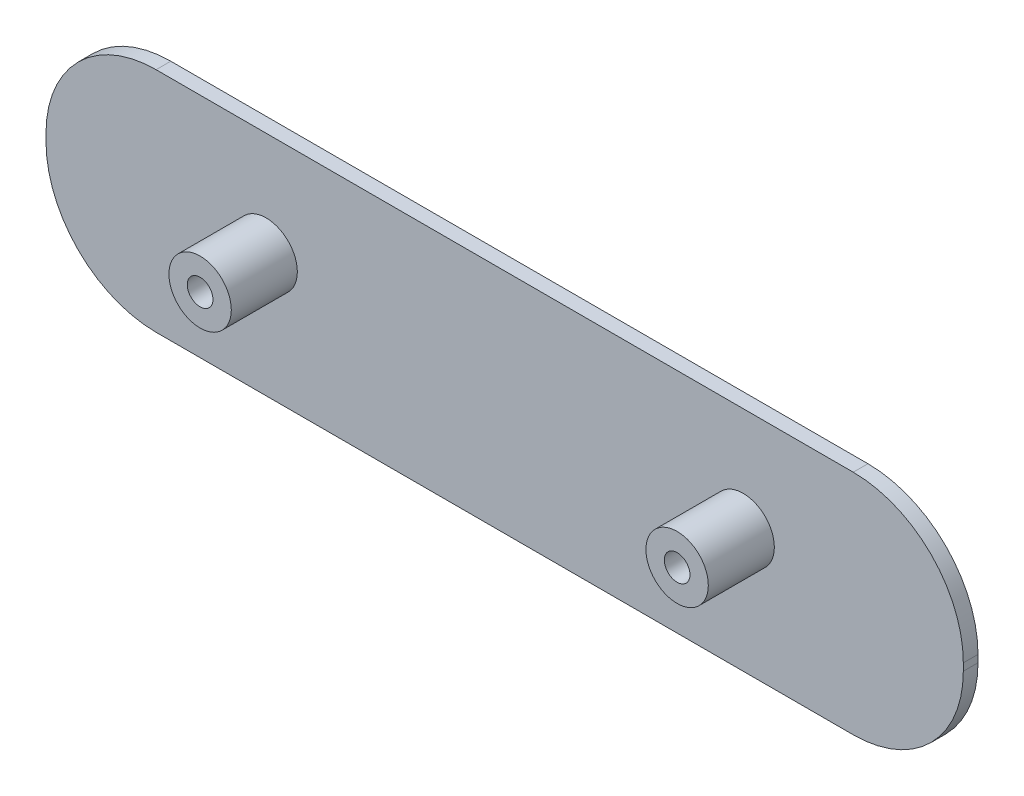
ISO-10303-21;
HEADER;
FILE_DESCRIPTION(('STEP AP214'),'2;1');
FILE_NAME('part.step','',(''),(''),'','','');
FILE_SCHEMA(('AUTOMOTIVE_DESIGN { 1 0 10303 214 1 1 1 1 }'));
ENDSEC;
DATA;
#1=APPLICATION_CONTEXT('core data for automotive mechanical design processes');
#2=APPLICATION_PROTOCOL_DEFINITION('international standard','automotive_design',2000,#1);
#3=PRODUCT_CONTEXT('',#1,'mechanical');
#4=PRODUCT('Part','Part','',(#3));
#5=PRODUCT_RELATED_PRODUCT_CATEGORY('part','',(#4));
#6=PRODUCT_DEFINITION_FORMATION('','',#4);
#7=PRODUCT_DEFINITION_CONTEXT('part definition',#1,'design');
#8=PRODUCT_DEFINITION('design','',#6,#7);
#9=PRODUCT_DEFINITION_SHAPE('','',#8);
#10=(LENGTH_UNIT() NAMED_UNIT(*) SI_UNIT(.MILLI.,.METRE.));
#11=(NAMED_UNIT(*) PLANE_ANGLE_UNIT() SI_UNIT($,.RADIAN.));
#12=(NAMED_UNIT(*) SI_UNIT($,.STERADIAN.) SOLID_ANGLE_UNIT());
#13=UNCERTAINTY_MEASURE_WITH_UNIT(LENGTH_MEASURE(1.E-05),#10,'distance_accuracy_value','');
#14=(GEOMETRIC_REPRESENTATION_CONTEXT(3) GLOBAL_UNCERTAINTY_ASSIGNED_CONTEXT((#13)) GLOBAL_UNIT_ASSIGNED_CONTEXT((#10,
#11,#12)) REPRESENTATION_CONTEXT('',''));
#15=CARTESIAN_POINT('',(0.,0.,0.));
#16=DIRECTION('',(0.,0.,1.));
#17=DIRECTION('',(1.,0.,0.));
#18=AXIS2_PLACEMENT_3D('',#15,#16,#17);
#19=CARTESIAN_POINT('',(0.,0.,2.));
#20=DIRECTION('',(-1.,0.,0.));
#21=DIRECTION('',(0.,-1.,0.));
#22=AXIS2_PLACEMENT_3D('',#19,#20,#21);
#23=PLANE('',#22);
#24=DIRECTION('',(0.,1.,0.));
#25=VECTOR('',#24,1.);
#26=CARTESIAN_POINT('',(0.,0.,0.));
#27=LINE('',#26,#25);
#28=CARTESIAN_POINT('',(0.,15.,0.));
#29=VERTEX_POINT('',#28);
#30=CARTESIAN_POINT('',(0.,15.99,0.));
#31=VERTEX_POINT('',#30);
#32=EDGE_CURVE('E133',#29,#31,#27,.T.);
#33=ORIENTED_EDGE('',*,*,#32,.T.);
#34=DIRECTION('',(0.,0.,-1.));
#35=VECTOR('',#34,1.);
#36=CARTESIAN_POINT('',(0.,15.99,2.));
#37=LINE('',#36,#35);
#38=CARTESIAN_POINT('',(0.,15.99,2.));
#39=VERTEX_POINT('',#38);
#40=EDGE_CURVE('E111',#31,#39,#37,.F.);
#41=ORIENTED_EDGE('',*,*,#40,.T.);
#42=DIRECTION('',(0.,1.,0.));
#43=VECTOR('',#42,1.);
#44=CARTESIAN_POINT('',(0.,0.,2.));
#45=LINE('',#44,#43);
#46=CARTESIAN_POINT('',(0.,15.,2.));
#47=VERTEX_POINT('',#46);
#48=EDGE_CURVE('E143',#47,#39,#45,.T.);
#49=ORIENTED_EDGE('',*,*,#48,.F.);
#50=DIRECTION('',(0.,0.,-1.));
#51=VECTOR('',#50,1.);
#52=CARTESIAN_POINT('',(0.,15.,2.));
#53=LINE('',#52,#51);
#54=EDGE_CURVE('E116',#47,#29,#53,.T.);
#55=ORIENTED_EDGE('',*,*,#54,.T.);
#56=EDGE_LOOP('',(#33,#41,#49,#55));
#57=FACE_BOUND('',#56,.T.);
#58=ADVANCED_FACE('F39',(#57),#23,.F.);
#59=CARTESIAN_POINT('',(0.,30.99,2.));
#60=DIRECTION('',(0.,-1.,0.));
#61=DIRECTION('',(1.,0.,0.));
#62=AXIS2_PLACEMENT_3D('',#59,#60,#61);
#63=PLANE('',#62);
#64=DIRECTION('',(-1.,0.,0.));
#65=VECTOR('',#64,1.);
#66=CARTESIAN_POINT('',(0.,30.99,2.));
#67=LINE('',#66,#65);
#68=CARTESIAN_POINT('',(-15.,30.99,2.));
#69=VERTEX_POINT('',#68);
#70=CARTESIAN_POINT('',(-110.,30.99,2.));
#71=VERTEX_POINT('',#70);
#72=EDGE_CURVE('E126',#69,#71,#67,.T.);
#73=ORIENTED_EDGE('',*,*,#72,.F.);
#74=DIRECTION('',(0.,0.,-1.));
#75=VECTOR('',#74,1.);
#76=CARTESIAN_POINT('',(-15.,30.99,2.));
#77=LINE('',#76,#75);
#78=CARTESIAN_POINT('',(-15.,30.99,0.));
#79=VERTEX_POINT('',#78);
#80=EDGE_CURVE('E110',#69,#79,#77,.T.);
#81=ORIENTED_EDGE('',*,*,#80,.T.);
#82=DIRECTION('',(-1.,0.,0.));
#83=VECTOR('',#82,1.);
#84=CARTESIAN_POINT('',(0.,30.99,0.));
#85=LINE('',#84,#83);
#86=CARTESIAN_POINT('',(-110.,30.99,0.));
#87=VERTEX_POINT('',#86);
#88=EDGE_CURVE('E123',#79,#87,#85,.T.);
#89=ORIENTED_EDGE('',*,*,#88,.T.);
#90=DIRECTION('',(0.,0.,-1.));
#91=VECTOR('',#90,1.);
#92=CARTESIAN_POINT('',(-110.,30.99,2.));
#93=LINE('',#92,#91);
#94=EDGE_CURVE('E128',#87,#71,#93,.F.);
#95=ORIENTED_EDGE('',*,*,#94,.T.);
#96=EDGE_LOOP('',(#73,#81,#89,#95));
#97=FACE_BOUND('',#96,.T.);
#98=ADVANCED_FACE('F122',(#97),#63,.F.);
#99=CARTESIAN_POINT('',(-125.,0.,2.));
#100=DIRECTION('',(1.,0.,0.));
#101=DIRECTION('',(0.,0.,-1.));
#102=AXIS2_PLACEMENT_3D('',#99,#100,#101);
#103=PLANE('',#102);
#104=DIRECTION('',(0.,-1.,0.));
#105=VECTOR('',#104,1.);
#106=CARTESIAN_POINT('',(-125.,0.,0.));
#107=LINE('',#106,#105);
#108=CARTESIAN_POINT('',(-125.,15.99,0.));
#109=VERTEX_POINT('',#108);
#110=CARTESIAN_POINT('',(-125.,15.,0.));
#111=VERTEX_POINT('',#110);
#112=EDGE_CURVE('E132',#109,#111,#107,.T.);
#113=ORIENTED_EDGE('',*,*,#112,.T.);
#114=DIRECTION('',(0.,0.,-1.));
#115=VECTOR('',#114,1.);
#116=CARTESIAN_POINT('',(-125.,15.,2.));
#117=LINE('',#116,#115);
#118=CARTESIAN_POINT('',(-125.,15.,2.));
#119=VERTEX_POINT('',#118);
#120=EDGE_CURVE('E167',#111,#119,#117,.F.);
#121=ORIENTED_EDGE('',*,*,#120,.T.);
#122=DIRECTION('',(0.,-1.,0.));
#123=VECTOR('',#122,1.);
#124=CARTESIAN_POINT('',(-125.,0.,2.));
#125=LINE('',#124,#123);
#126=CARTESIAN_POINT('',(-125.,15.99,2.));
#127=VERTEX_POINT('',#126);
#128=EDGE_CURVE('E230',#127,#119,#125,.T.);
#129=ORIENTED_EDGE('',*,*,#128,.F.);
#130=DIRECTION('',(0.,0.,-1.));
#131=VECTOR('',#130,1.);
#132=CARTESIAN_POINT('',(-125.,15.99,2.));
#133=LINE('',#132,#131);
#134=EDGE_CURVE('E164',#127,#109,#133,.T.);
#135=ORIENTED_EDGE('',*,*,#134,.T.);
#136=EDGE_LOOP('',(#113,#121,#129,#135));
#137=FACE_BOUND('',#136,.T.);
#138=ADVANCED_FACE('F205',(#137),#103,.F.);
#139=CARTESIAN_POINT('',(0.,0.,2.));
#140=DIRECTION('',(0.,1.,0.));
#141=DIRECTION('',(-1.,0.,0.));
#142=AXIS2_PLACEMENT_3D('',#139,#140,#141);
#143=PLANE('',#142);
#144=DIRECTION('',(1.,0.,0.));
#145=VECTOR('',#144,1.);
#146=CARTESIAN_POINT('',(0.,0.,0.));
#147=LINE('',#146,#145);
#148=CARTESIAN_POINT('',(-110.,0.,0.));
#149=VERTEX_POINT('',#148);
#150=CARTESIAN_POINT('',(-15.,0.,0.));
#151=VERTEX_POINT('',#150);
#152=EDGE_CURVE('E136',#149,#151,#147,.T.);
#153=ORIENTED_EDGE('',*,*,#152,.T.);
#154=DIRECTION('',(0.,0.,-1.));
#155=VECTOR('',#154,1.);
#156=CARTESIAN_POINT('',(-15.,0.,2.));
#157=LINE('',#156,#155);
#158=CARTESIAN_POINT('',(-15.,0.,2.));
#159=VERTEX_POINT('',#158);
#160=EDGE_CURVE('E54',#151,#159,#157,.F.);
#161=ORIENTED_EDGE('',*,*,#160,.T.);
#162=DIRECTION('',(1.,0.,0.));
#163=VECTOR('',#162,1.);
#164=CARTESIAN_POINT('',(0.,0.,2.));
#165=LINE('',#164,#163);
#166=CARTESIAN_POINT('',(-110.,0.,2.));
#167=VERTEX_POINT('',#166);
#168=EDGE_CURVE('E144',#167,#159,#165,.T.);
#169=ORIENTED_EDGE('',*,*,#168,.F.);
#170=DIRECTION('',(0.,0.,-1.));
#171=VECTOR('',#170,1.);
#172=CARTESIAN_POINT('',(-110.,0.,2.));
#173=LINE('',#172,#171);
#174=EDGE_CURVE('E160',#167,#149,#173,.T.);
#175=ORIENTED_EDGE('',*,*,#174,.T.);
#176=EDGE_LOOP('',(#153,#161,#169,#175));
#177=FACE_BOUND('',#176,.T.);
#178=ADVANCED_FACE('F194',(#177),#143,.F.);
#179=CARTESIAN_POINT('',(0.,0.,2.));
#180=DIRECTION('',(0.,0.,1.));
#181=DIRECTION('',(1.,0.,0.));
#182=AXIS2_PLACEMENT_3D('',#179,#180,#181);
#183=PLANE('',#182);
#184=CARTESIAN_POINT('',(-30.,16.75,2.));
#185=DIRECTION('',(0.,0.,1.));
#186=DIRECTION('',(1.,0.,0.));
#187=AXIS2_PLACEMENT_3D('',#184,#185,#186);
#188=CIRCLE('',#187,4.25);
#189=CARTESIAN_POINT('',(-25.75,16.75,2.));
#190=VERTEX_POINT('',#189);
#191=EDGE_CURVE('E398',#190,#190,#188,.T.);
#192=ORIENTED_EDGE('',*,*,#191,.F.);
#193=EDGE_LOOP('',(#192));
#194=FACE_BOUND('',#193,.T.);
#195=CARTESIAN_POINT('',(-95.,16.75,2.));
#196=DIRECTION('',(0.,0.,1.));
#197=DIRECTION('',(1.,0.,0.));
#198=AXIS2_PLACEMENT_3D('',#195,#196,#197);
#199=CIRCLE('',#198,4.25);
#200=CARTESIAN_POINT('',(-90.75,16.75,2.));
#201=VERTEX_POINT('',#200);
#202=EDGE_CURVE('E233',#201,#201,#199,.T.);
#203=ORIENTED_EDGE('',*,*,#202,.F.);
#204=EDGE_LOOP('',(#203));
#205=FACE_BOUND('',#204,.T.);
#206=ORIENTED_EDGE('',*,*,#48,.T.);
#207=CARTESIAN_POINT('',(-15.,15.99,2.));
#208=DIRECTION('',(0.,0.,1.));
#209=DIRECTION('',(1.,0.,0.));
#210=AXIS2_PLACEMENT_3D('',#207,#208,#209);
#211=CIRCLE('',#210,15.);
#212=EDGE_CURVE('E158',#39,#69,#211,.T.);
#213=ORIENTED_EDGE('',*,*,#212,.T.);
#214=ORIENTED_EDGE('',*,*,#72,.T.);
#215=CARTESIAN_POINT('',(-110.,15.99,2.));
#216=DIRECTION('',(0.,0.,1.));
#217=DIRECTION('',(1.,0.,0.));
#218=AXIS2_PLACEMENT_3D('',#215,#216,#217);
#219=CIRCLE('',#218,15.);
#220=EDGE_CURVE('E153',#71,#127,#219,.T.);
#221=ORIENTED_EDGE('',*,*,#220,.T.);
#222=ORIENTED_EDGE('',*,*,#128,.T.);
#223=CARTESIAN_POINT('',(-110.,15.,2.));
#224=DIRECTION('',(0.,0.,1.));
#225=DIRECTION('',(1.,0.,0.));
#226=AXIS2_PLACEMENT_3D('',#223,#224,#225);
#227=CIRCLE('',#226,15.);
#228=EDGE_CURVE('E61',#119,#167,#227,.T.);
#229=ORIENTED_EDGE('',*,*,#228,.T.);
#230=ORIENTED_EDGE('',*,*,#168,.T.);
#231=CARTESIAN_POINT('',(-15.,15.,2.));
#232=DIRECTION('',(0.,0.,1.));
#233=DIRECTION('',(1.,0.,0.));
#234=AXIS2_PLACEMENT_3D('',#231,#232,#233);
#235=CIRCLE('',#234,15.);
#236=EDGE_CURVE('E156',#159,#47,#235,.T.);
#237=ORIENTED_EDGE('',*,*,#236,.T.);
#238=EDGE_LOOP('',(#206,#213,#214,#221,#222,#229,#230,#237));
#239=FACE_BOUND('',#238,.T.);
#240=ADVANCED_FACE('F177',(#194,#205,#239),#183,.T.);
#241=CARTESIAN_POINT('',(0.,0.,0.));
#242=DIRECTION('',(0.,0.,1.));
#243=DIRECTION('',(1.,0.,0.));
#244=AXIS2_PLACEMENT_3D('',#241,#242,#243);
#245=PLANE('',#244);
#246=ORIENTED_EDGE('',*,*,#88,.F.);
#247=CARTESIAN_POINT('',(-15.,15.99,0.));
#248=DIRECTION('',(0.,0.,1.));
#249=DIRECTION('',(1.,0.,0.));
#250=AXIS2_PLACEMENT_3D('',#247,#248,#249);
#251=CIRCLE('',#250,15.);
#252=EDGE_CURVE('E106',#79,#31,#251,.F.);
#253=ORIENTED_EDGE('',*,*,#252,.T.);
#254=ORIENTED_EDGE('',*,*,#32,.F.);
#255=CARTESIAN_POINT('',(-15.,15.,0.));
#256=DIRECTION('',(0.,0.,1.));
#257=DIRECTION('',(1.,0.,0.));
#258=AXIS2_PLACEMENT_3D('',#255,#256,#257);
#259=CIRCLE('',#258,15.);
#260=EDGE_CURVE('E117',#29,#151,#259,.F.);
#261=ORIENTED_EDGE('',*,*,#260,.T.);
#262=ORIENTED_EDGE('',*,*,#152,.F.);
#263=CARTESIAN_POINT('',(-110.,15.,0.));
#264=DIRECTION('',(0.,0.,1.));
#265=DIRECTION('',(1.,0.,0.));
#266=AXIS2_PLACEMENT_3D('',#263,#264,#265);
#267=CIRCLE('',#266,15.);
#268=EDGE_CURVE('E147',#149,#111,#267,.F.);
#269=ORIENTED_EDGE('',*,*,#268,.T.);
#270=ORIENTED_EDGE('',*,*,#112,.F.);
#271=CARTESIAN_POINT('',(-110.,15.99,0.));
#272=DIRECTION('',(0.,0.,1.));
#273=DIRECTION('',(1.,0.,0.));
#274=AXIS2_PLACEMENT_3D('',#271,#272,#273);
#275=CIRCLE('',#274,15.);
#276=EDGE_CURVE('E127',#109,#87,#275,.F.);
#277=ORIENTED_EDGE('',*,*,#276,.T.);
#278=EDGE_LOOP('',(#246,#253,#254,#261,#262,#269,#270,#277));
#279=FACE_BOUND('',#278,.T.);
#280=ADVANCED_FACE('F130',(#279),#245,.F.);
#281=CARTESIAN_POINT('',(-15.,15.99,2.));
#282=DIRECTION('',(0.,0.,-1.));
#283=DIRECTION('',(-1.,0.,0.));
#284=AXIS2_PLACEMENT_3D('',#281,#282,#283);
#285=CYLINDRICAL_SURFACE('',#284,15.);
#286=ORIENTED_EDGE('',*,*,#212,.F.);
#287=ORIENTED_EDGE('',*,*,#40,.F.);
#288=ORIENTED_EDGE('',*,*,#252,.F.);
#289=ORIENTED_EDGE('',*,*,#80,.F.);
#290=EDGE_LOOP('',(#286,#287,#288,#289));
#291=FACE_BOUND('',#290,.T.);
#292=ADVANCED_FACE('F109',(#291),#285,.T.);
#293=CARTESIAN_POINT('',(-15.,15.,2.));
#294=DIRECTION('',(0.,0.,-1.));
#295=DIRECTION('',(-1.,0.,0.));
#296=AXIS2_PLACEMENT_3D('',#293,#294,#295);
#297=CYLINDRICAL_SURFACE('',#296,15.);
#298=ORIENTED_EDGE('',*,*,#236,.F.);
#299=ORIENTED_EDGE('',*,*,#160,.F.);
#300=ORIENTED_EDGE('',*,*,#260,.F.);
#301=ORIENTED_EDGE('',*,*,#54,.F.);
#302=EDGE_LOOP('',(#298,#299,#300,#301));
#303=FACE_BOUND('',#302,.T.);
#304=ADVANCED_FACE('F211',(#303),#297,.T.);
#305=CARTESIAN_POINT('',(-110.,15.,2.));
#306=DIRECTION('',(0.,0.,-1.));
#307=DIRECTION('',(-1.,0.,0.));
#308=AXIS2_PLACEMENT_3D('',#305,#306,#307);
#309=CYLINDRICAL_SURFACE('',#308,15.);
#310=ORIENTED_EDGE('',*,*,#228,.F.);
#311=ORIENTED_EDGE('',*,*,#120,.F.);
#312=ORIENTED_EDGE('',*,*,#268,.F.);
#313=ORIENTED_EDGE('',*,*,#174,.F.);
#314=EDGE_LOOP('',(#310,#311,#312,#313));
#315=FACE_BOUND('',#314,.T.);
#316=ADVANCED_FACE('F213',(#315),#309,.T.);
#317=CARTESIAN_POINT('',(-110.,15.99,2.));
#318=DIRECTION('',(0.,0.,-1.));
#319=DIRECTION('',(-1.,0.,0.));
#320=AXIS2_PLACEMENT_3D('',#317,#318,#319);
#321=CYLINDRICAL_SURFACE('',#320,15.);
#322=ORIENTED_EDGE('',*,*,#220,.F.);
#323=ORIENTED_EDGE('',*,*,#94,.F.);
#324=ORIENTED_EDGE('',*,*,#276,.F.);
#325=ORIENTED_EDGE('',*,*,#134,.F.);
#326=EDGE_LOOP('',(#322,#323,#324,#325));
#327=FACE_BOUND('',#326,.T.);
#328=ADVANCED_FACE('F41',(#327),#321,.T.);
#329=CARTESIAN_POINT('',(-95.,16.75,11.));
#330=DIRECTION('',(0.,0.,1.));
#331=DIRECTION('',(1.,0.,0.));
#332=AXIS2_PLACEMENT_3D('',#329,#330,#331);
#333=PLANE('',#332);
#334=CARTESIAN_POINT('',(-95.,16.75,11.));
#335=DIRECTION('',(0.,0.,1.));
#336=DIRECTION('',(1.,0.,0.));
#337=AXIS2_PLACEMENT_3D('',#334,#335,#336);
#338=CIRCLE('',#337,4.25);
#339=CARTESIAN_POINT('',(-90.75,16.75,11.));
#340=VERTEX_POINT('',#339);
#341=EDGE_CURVE('E138',#340,#340,#338,.T.);
#342=ORIENTED_EDGE('',*,*,#341,.T.);
#343=EDGE_LOOP('',(#342));
#344=FACE_BOUND('',#343,.T.);
#345=CARTESIAN_POINT('',(-95.,16.75,11.));
#346=DIRECTION('',(0.,0.,1.));
#347=DIRECTION('',(1.,0.,0.));
#348=AXIS2_PLACEMENT_3D('',#345,#346,#347);
#349=CIRCLE('',#348,1.75);
#350=CARTESIAN_POINT('',(-93.25,16.75,11.));
#351=VERTEX_POINT('',#350);
#352=EDGE_CURVE('E397',#351,#351,#349,.T.);
#353=ORIENTED_EDGE('',*,*,#352,.F.);
#354=EDGE_LOOP('',(#353));
#355=FACE_BOUND('',#354,.T.);
#356=ADVANCED_FACE('F220',(#344,#355),#333,.T.);
#357=CARTESIAN_POINT('',(-95.,16.75,11.));
#358=DIRECTION('',(0.,0.,-1.));
#359=DIRECTION('',(-1.,0.,0.));
#360=AXIS2_PLACEMENT_3D('',#357,#358,#359);
#361=CYLINDRICAL_SURFACE('',#360,4.25);
#362=ORIENTED_EDGE('',*,*,#341,.F.);
#363=EDGE_LOOP('',(#362));
#364=FACE_BOUND('',#363,.T.);
#365=ORIENTED_EDGE('',*,*,#202,.T.);
#366=EDGE_LOOP('',(#365));
#367=FACE_BOUND('',#366,.T.);
#368=ADVANCED_FACE('F188',(#364,#367),#361,.T.);
#369=CARTESIAN_POINT('',(-95.,16.75,11.));
#370=DIRECTION('',(0.,0.,-1.));
#371=DIRECTION('',(-1.,0.,0.));
#372=AXIS2_PLACEMENT_3D('',#369,#370,#371);
#373=CYLINDRICAL_SURFACE('',#372,1.75);
#374=ORIENTED_EDGE('',*,*,#352,.T.);
#375=EDGE_LOOP('',(#374));
#376=FACE_BOUND('',#375,.T.);
#377=CARTESIAN_POINT('',(-95.,16.75,2.));
#378=DIRECTION('',(0.,0.,1.));
#379=DIRECTION('',(1.,0.,0.));
#380=AXIS2_PLACEMENT_3D('',#377,#378,#379);
#381=CIRCLE('',#380,1.75);
#382=CARTESIAN_POINT('',(-93.25,16.75,2.));
#383=VERTEX_POINT('',#382);
#384=EDGE_CURVE('E47',#383,#383,#381,.F.);
#385=ORIENTED_EDGE('',*,*,#384,.T.);
#386=EDGE_LOOP('',(#385));
#387=FACE_BOUND('',#386,.T.);
#388=ADVANCED_FACE('F171',(#376,#387),#373,.F.);
#389=ORIENTED_EDGE('',*,*,#384,.F.);
#390=EDGE_LOOP('',(#389));
#391=FACE_BOUND('',#390,.T.);
#392=ADVANCED_FACE('F173',(#391),#183,.T.);
#393=CARTESIAN_POINT('',(-30.,16.75,11.));
#394=DIRECTION('',(0.,0.,1.));
#395=DIRECTION('',(1.,0.,0.));
#396=AXIS2_PLACEMENT_3D('',#393,#394,#395);
#397=PLANE('',#396);
#398=CARTESIAN_POINT('',(-30.,16.75,11.));
#399=DIRECTION('',(0.,0.,1.));
#400=DIRECTION('',(1.,0.,0.));
#401=AXIS2_PLACEMENT_3D('',#398,#399,#400);
#402=CIRCLE('',#401,4.25);
#403=CARTESIAN_POINT('',(-25.75,16.75,11.));
#404=VERTEX_POINT('',#403);
#405=EDGE_CURVE('E403',#404,#404,#402,.T.);
#406=ORIENTED_EDGE('',*,*,#405,.T.);
#407=EDGE_LOOP('',(#406));
#408=FACE_BOUND('',#407,.T.);
#409=CARTESIAN_POINT('',(-30.,16.75,11.));
#410=DIRECTION('',(0.,0.,1.));
#411=DIRECTION('',(1.,0.,0.));
#412=AXIS2_PLACEMENT_3D('',#409,#410,#411);
#413=CIRCLE('',#412,1.75);
#414=CARTESIAN_POINT('',(-28.25,16.75,11.));
#415=VERTEX_POINT('',#414);
#416=EDGE_CURVE('E394',#415,#415,#413,.T.);
#417=ORIENTED_EDGE('',*,*,#416,.F.);
#418=EDGE_LOOP('',(#417));
#419=FACE_BOUND('',#418,.T.);
#420=ADVANCED_FACE('F175',(#408,#419),#397,.T.);
#421=CARTESIAN_POINT('',(-30.,16.75,11.));
#422=DIRECTION('',(0.,0.,-1.));
#423=DIRECTION('',(-1.,0.,0.));
#424=AXIS2_PLACEMENT_3D('',#421,#422,#423);
#425=CYLINDRICAL_SURFACE('',#424,4.25);
#426=ORIENTED_EDGE('',*,*,#405,.F.);
#427=EDGE_LOOP('',(#426));
#428=FACE_BOUND('',#427,.T.);
#429=ORIENTED_EDGE('',*,*,#191,.T.);
#430=EDGE_LOOP('',(#429));
#431=FACE_BOUND('',#430,.T.);
#432=ADVANCED_FACE('F184',(#428,#431),#425,.T.);
#433=CARTESIAN_POINT('',(-30.,16.75,11.));
#434=DIRECTION('',(0.,0.,-1.));
#435=DIRECTION('',(-1.,0.,0.));
#436=AXIS2_PLACEMENT_3D('',#433,#434,#435);
#437=CYLINDRICAL_SURFACE('',#436,1.75);
#438=ORIENTED_EDGE('',*,*,#416,.T.);
#439=EDGE_LOOP('',(#438));
#440=FACE_BOUND('',#439,.T.);
#441=CARTESIAN_POINT('',(-30.,16.75,2.));
#442=DIRECTION('',(0.,0.,1.));
#443=DIRECTION('',(1.,0.,0.));
#444=AXIS2_PLACEMENT_3D('',#441,#442,#443);
#445=CIRCLE('',#444,1.75);
#446=CARTESIAN_POINT('',(-28.25,16.75,2.));
#447=VERTEX_POINT('',#446);
#448=EDGE_CURVE('E11',#447,#447,#445,.F.);
#449=ORIENTED_EDGE('',*,*,#448,.T.);
#450=EDGE_LOOP('',(#449));
#451=FACE_BOUND('',#450,.T.);
#452=ADVANCED_FACE('F197',(#440,#451),#437,.F.);
#453=ORIENTED_EDGE('',*,*,#448,.F.);
#454=EDGE_LOOP('',(#453));
#455=FACE_BOUND('',#454,.T.);
#456=ADVANCED_FACE('F178',(#455),#183,.T.);
#457=CLOSED_SHELL('',(#58,#98,#138,#178,#240,#280,#292,#304,#316,#328,#356,#368,#388,#392,#420,
#432,#452,#456));
#458=MANIFOLD_SOLID_BREP('B2',#457);
#459=ADVANCED_BREP_SHAPE_REPRESENTATION('',(#18,#458),#14);
#460=SHAPE_DEFINITION_REPRESENTATION(#9,#459);
ENDSEC;
END-ISO-10303-21;
